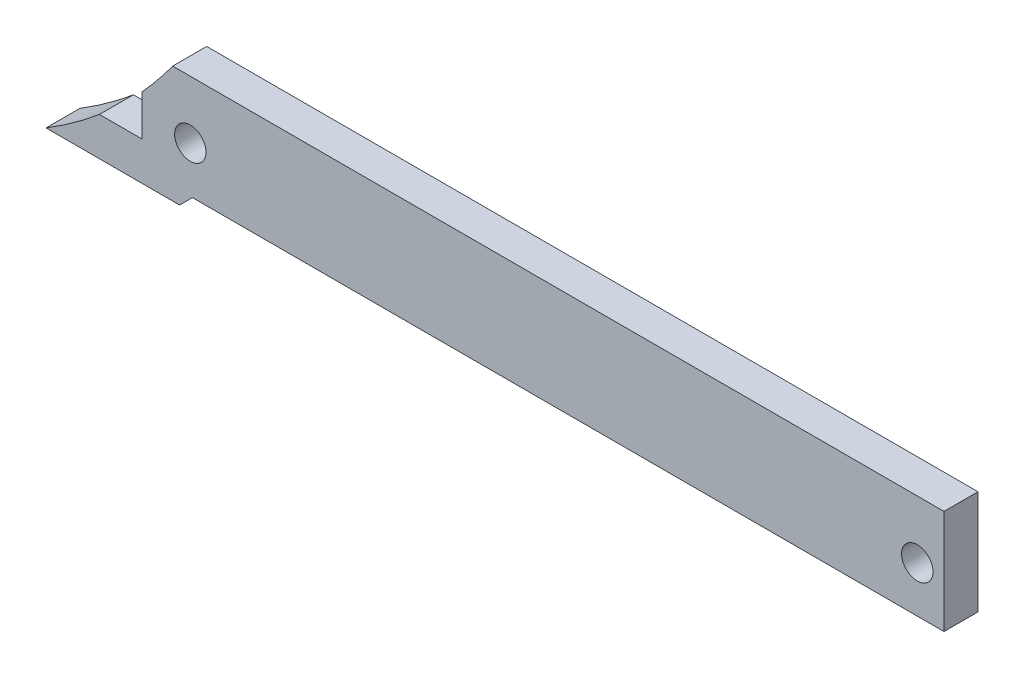
ISO-10303-21;
HEADER;
FILE_DESCRIPTION(('STEP AP214'),'2;1');
FILE_NAME('part.step','',(''),(''),'','','');
FILE_SCHEMA(('AUTOMOTIVE_DESIGN { 1 0 10303 214 1 1 1 1 }'));
ENDSEC;
DATA;
#1=APPLICATION_CONTEXT('core data for automotive mechanical design processes');
#2=APPLICATION_PROTOCOL_DEFINITION('international standard','automotive_design',2000,#1);
#3=PRODUCT_CONTEXT('',#1,'mechanical');
#4=PRODUCT('Part','Part','',(#3));
#5=PRODUCT_RELATED_PRODUCT_CATEGORY('part','',(#4));
#6=PRODUCT_DEFINITION_FORMATION('','',#4);
#7=PRODUCT_DEFINITION_CONTEXT('part definition',#1,'design');
#8=PRODUCT_DEFINITION('design','',#6,#7);
#9=PRODUCT_DEFINITION_SHAPE('','',#8);
#10=(LENGTH_UNIT() NAMED_UNIT(*) SI_UNIT(.MILLI.,.METRE.));
#11=(NAMED_UNIT(*) PLANE_ANGLE_UNIT() SI_UNIT($,.RADIAN.));
#12=(NAMED_UNIT(*) SI_UNIT($,.STERADIAN.) SOLID_ANGLE_UNIT());
#13=UNCERTAINTY_MEASURE_WITH_UNIT(LENGTH_MEASURE(1.E-05),#10,'distance_accuracy_value','');
#14=(GEOMETRIC_REPRESENTATION_CONTEXT(3) GLOBAL_UNCERTAINTY_ASSIGNED_CONTEXT((#13)) GLOBAL_UNIT_ASSIGNED_CONTEXT((#10,
#11,#12)) REPRESENTATION_CONTEXT('',''));
#15=CARTESIAN_POINT('',(0.,0.,0.));
#16=DIRECTION('',(0.,0.,1.));
#17=DIRECTION('',(1.,0.,0.));
#18=AXIS2_PLACEMENT_3D('',#15,#16,#17);
#19=CARTESIAN_POINT('',(-30.5121411623112,31.5191740095268,3.18));
#20=DIRECTION('',(0.,0.,-1.));
#21=DIRECTION('',(-1.,0.,0.));
#22=AXIS2_PLACEMENT_3D('',#19,#20,#21);
#23=PLANE('',#22);
#24=CARTESIAN_POINT('',(4.5,1.84,3.18));
#25=DIRECTION('',(0.,0.,1.));
#26=DIRECTION('',(1.,0.,0.));
#27=AXIS2_PLACEMENT_3D('',#24,#25,#26);
#28=CIRCLE('',#27,1.47);
#29=CARTESIAN_POINT('',(5.97,1.84,3.18));
#30=VERTEX_POINT('',#29);
#31=EDGE_CURVE('E196',#30,#30,#28,.T.);
#32=ORIENTED_EDGE('',*,*,#31,.F.);
#33=EDGE_LOOP('',(#32));
#34=FACE_BOUND('',#33,.T.);
#35=DIRECTION('',(0.,1.,0.));
#36=VECTOR('',#35,1.);
#37=CARTESIAN_POINT('',(75.,0.0244168797868836,3.18));
#38=LINE('',#37,#36);
#39=CARTESIAN_POINT('',(75.,-2.47558312021312,3.18));
#40=VERTEX_POINT('',#39);
#41=CARTESIAN_POINT('',(75.,7.25999999999985,3.18));
#42=VERTEX_POINT('',#41);
#43=EDGE_CURVE('E120',#40,#42,#38,.T.);
#44=ORIENTED_EDGE('',*,*,#43,.T.);
#45=DIRECTION('',(-1.,0.,0.));
#46=VECTOR('',#45,1.);
#47=CARTESIAN_POINT('',(2.85033740831529,7.25999999999985,3.18));
#48=LINE('',#47,#46);
#49=CARTESIAN_POINT('',(2.85033740831529,7.25999999999985,3.18));
#50=VERTEX_POINT('',#49);
#51=EDGE_CURVE('E164',#42,#50,#48,.T.);
#52=ORIENTED_EDGE('',*,*,#51,.T.);
#53=CARTESIAN_POINT('',(-30.5121411623086,31.5191740095271,3.18));
#54=DIRECTION('',(0.,0.,-1.));
#55=DIRECTION('',(-1.,0.,0.));
#56=AXIS2_PLACEMENT_3D('',#53,#54,#55);
#57=CIRCLE('',#56,41.2499999999983);
#58=CARTESIAN_POINT('',(0.,3.76000000000001,3.18));
#59=VERTEX_POINT('',#58);
#60=EDGE_CURVE('E182',#50,#59,#57,.T.);
#61=ORIENTED_EDGE('',*,*,#60,.T.);
#62=DIRECTION('',(0.,-1.,0.));
#63=VECTOR('',#62,1.);
#64=CARTESIAN_POINT('',(0.,0.,3.18));
#65=LINE('',#64,#63);
#66=CARTESIAN_POINT('',(0.,-0.0825485857634672,3.18));
#67=VERTEX_POINT('',#66);
#68=EDGE_CURVE('E90',#59,#67,#65,.T.);
#69=ORIENTED_EDGE('',*,*,#68,.T.);
#70=DIRECTION('',(-1.,0.,0.));
#71=VECTOR('',#70,1.);
#72=CARTESIAN_POINT('',(0.,-0.0825485857634672,3.18));
#73=LINE('',#72,#71);
#74=CARTESIAN_POINT('',(-4.,-0.0825485857634395,3.18));
#75=VERTEX_POINT('',#74);
#76=EDGE_CURVE('E208',#67,#75,#73,.T.);
#77=ORIENTED_EDGE('',*,*,#76,.T.);
#78=CARTESIAN_POINT('',(-30.5121411623112,31.5191740095268,3.18));
#79=DIRECTION('',(0.,0.,-1.));
#80=DIRECTION('',(-1.,0.,0.));
#81=AXIS2_PLACEMENT_3D('',#78,#79,#80);
#82=CIRCLE('',#81,41.25);
#83=CARTESIAN_POINT('',(-9.00000000000001,-3.67727868975512,3.18));
#84=VERTEX_POINT('',#83);
#85=EDGE_CURVE('E106',#75,#84,#82,.T.);
#86=ORIENTED_EDGE('',*,*,#85,.T.);
#87=DIRECTION('',(1.,0.,0.));
#88=VECTOR('',#87,1.);
#89=CARTESIAN_POINT('',(-9.00000000000001,-3.67727868975512,3.18));
#90=LINE('',#89,#88);
#91=CARTESIAN_POINT('',(3.5,-3.67727868975512,3.18));
#92=VERTEX_POINT('',#91);
#93=EDGE_CURVE('E100',#84,#92,#90,.T.);
#94=ORIENTED_EDGE('',*,*,#93,.T.);
#95=DIRECTION('',(0.707106781186546,0.707106781186549,0.));
#96=VECTOR('',#95,1.);
#97=CARTESIAN_POINT('',(3.5,-3.67727868975512,3.18));
#98=LINE('',#97,#96);
#99=CARTESIAN_POINT('',(4.70169556954198,-2.47558312021314,3.18));
#100=VERTEX_POINT('',#99);
#101=EDGE_CURVE('E104',#92,#100,#98,.T.);
#102=ORIENTED_EDGE('',*,*,#101,.T.);
#103=DIRECTION('',(1.,0.,0.));
#104=VECTOR('',#103,1.);
#105=CARTESIAN_POINT('',(75.,-2.47558312021312,3.18));
#106=LINE('',#105,#104);
#107=EDGE_CURVE('E50',#100,#40,#106,.T.);
#108=ORIENTED_EDGE('',*,*,#107,.T.);
#109=EDGE_LOOP('',(#44,#52,#61,#69,#77,#86,#94,#102,#108));
#110=FACE_BOUND('',#109,.T.);
#111=CARTESIAN_POINT('',(72.5,1.84,3.18));
#112=DIRECTION('',(0.,0.,1.));
#113=DIRECTION('',(1.,0.,0.));
#114=AXIS2_PLACEMENT_3D('',#111,#112,#113);
#115=CIRCLE('',#114,1.46999999999999);
#116=CARTESIAN_POINT('',(71.03,1.84,3.18));
#117=VERTEX_POINT('',#116);
#118=EDGE_CURVE('E129',#117,#117,#115,.T.);
#119=ORIENTED_EDGE('',*,*,#118,.F.);
#120=EDGE_LOOP('',(#119));
#121=FACE_BOUND('',#120,.T.);
#122=ADVANCED_FACE('F33',(#34,#110,#121),#23,.F.);
#123=CARTESIAN_POINT('',(-30.5121411623112,31.5191740095268,0.));
#124=DIRECTION('',(0.,0.,-1.));
#125=DIRECTION('',(-1.,0.,0.));
#126=AXIS2_PLACEMENT_3D('',#123,#124,#125);
#127=PLANE('',#126);
#128=DIRECTION('',(0.,-1.,0.));
#129=VECTOR('',#128,1.);
#130=CARTESIAN_POINT('',(0.,0.,0.));
#131=LINE('',#130,#129);
#132=CARTESIAN_POINT('',(0.,3.75999999999985,0.));
#133=VERTEX_POINT('',#132);
#134=CARTESIAN_POINT('',(0.,-0.0825485857634672,0.));
#135=VERTEX_POINT('',#134);
#136=EDGE_CURVE('E136',#133,#135,#131,.T.);
#137=ORIENTED_EDGE('',*,*,#136,.F.);
#138=CARTESIAN_POINT('',(-30.5121411623086,31.5191740095271,0.));
#139=DIRECTION('',(0.,0.,1.));
#140=DIRECTION('',(1.,0.,0.));
#141=AXIS2_PLACEMENT_3D('',#138,#139,#140);
#142=CIRCLE('',#141,41.2499999999983);
#143=CARTESIAN_POINT('',(2.85033740831529,7.25999999999985,0.));
#144=VERTEX_POINT('',#143);
#145=EDGE_CURVE('E181',#133,#144,#142,.T.);
#146=ORIENTED_EDGE('',*,*,#145,.T.);
#147=DIRECTION('',(1.,0.,0.));
#148=VECTOR('',#147,1.);
#149=CARTESIAN_POINT('',(2.85033740831529,7.25999999999985,0.));
#150=LINE('',#149,#148);
#151=CARTESIAN_POINT('',(75.,7.25999999999985,0.));
#152=VERTEX_POINT('',#151);
#153=EDGE_CURVE('E184',#144,#152,#150,.T.);
#154=ORIENTED_EDGE('',*,*,#153,.T.);
#155=DIRECTION('',(0.,1.,0.));
#156=VECTOR('',#155,1.);
#157=CARTESIAN_POINT('',(75.,0.0244168797868836,0.));
#158=LINE('',#157,#156);
#159=CARTESIAN_POINT('',(75.,-2.47558312021312,0.));
#160=VERTEX_POINT('',#159);
#161=EDGE_CURVE('E82',#160,#152,#158,.T.);
#162=ORIENTED_EDGE('',*,*,#161,.F.);
#163=DIRECTION('',(1.,0.,0.));
#164=VECTOR('',#163,1.);
#165=CARTESIAN_POINT('',(75.,-2.47558312021312,0.));
#166=LINE('',#165,#164);
#167=CARTESIAN_POINT('',(4.70169556954198,-2.47558312021314,0.));
#168=VERTEX_POINT('',#167);
#169=EDGE_CURVE('E133',#168,#160,#166,.T.);
#170=ORIENTED_EDGE('',*,*,#169,.F.);
#171=DIRECTION('',(0.707106781186546,0.707106781186549,0.));
#172=VECTOR('',#171,1.);
#173=CARTESIAN_POINT('',(3.5,-3.67727868975512,0.));
#174=LINE('',#173,#172);
#175=CARTESIAN_POINT('',(3.5,-3.67727868975512,0.));
#176=VERTEX_POINT('',#175);
#177=EDGE_CURVE('E74',#176,#168,#174,.T.);
#178=ORIENTED_EDGE('',*,*,#177,.F.);
#179=DIRECTION('',(1.,0.,0.));
#180=VECTOR('',#179,1.);
#181=CARTESIAN_POINT('',(-9.00000000000001,-3.67727868975512,0.));
#182=LINE('',#181,#180);
#183=CARTESIAN_POINT('',(-9.00000000000001,-3.67727868975512,0.));
#184=VERTEX_POINT('',#183);
#185=EDGE_CURVE('E114',#184,#176,#182,.T.);
#186=ORIENTED_EDGE('',*,*,#185,.F.);
#187=CARTESIAN_POINT('',(-30.5121411623112,31.5191740095268,0.));
#188=DIRECTION('',(0.,0.,-1.));
#189=DIRECTION('',(-1.,0.,0.));
#190=AXIS2_PLACEMENT_3D('',#187,#188,#189);
#191=CIRCLE('',#190,41.25);
#192=CARTESIAN_POINT('',(-4.,-0.0825485857634395,0.));
#193=VERTEX_POINT('',#192);
#194=EDGE_CURVE('E128',#193,#184,#191,.T.);
#195=ORIENTED_EDGE('',*,*,#194,.F.);
#196=DIRECTION('',(-1.,0.,0.));
#197=VECTOR('',#196,1.);
#198=CARTESIAN_POINT('',(0.,-0.0825485857634672,0.));
#199=LINE('',#198,#197);
#200=EDGE_CURVE('E126',#135,#193,#199,.T.);
#201=ORIENTED_EDGE('',*,*,#200,.F.);
#202=EDGE_LOOP('',(#137,#146,#154,#162,#170,#178,#186,#195,#201));
#203=FACE_BOUND('',#202,.T.);
#204=CARTESIAN_POINT('',(4.5,1.84,0.));
#205=DIRECTION('',(0.,0.,1.));
#206=DIRECTION('',(1.,0.,0.));
#207=AXIS2_PLACEMENT_3D('',#204,#205,#206);
#208=CIRCLE('',#207,1.47);
#209=CARTESIAN_POINT('',(5.97,1.84,0.));
#210=VERTEX_POINT('',#209);
#211=EDGE_CURVE('E197',#210,#210,#208,.T.);
#212=ORIENTED_EDGE('',*,*,#211,.T.);
#213=EDGE_LOOP('',(#212));
#214=FACE_BOUND('',#213,.T.);
#215=CARTESIAN_POINT('',(72.5,1.84,0.));
#216=DIRECTION('',(0.,0.,1.));
#217=DIRECTION('',(1.,0.,0.));
#218=AXIS2_PLACEMENT_3D('',#215,#216,#217);
#219=CIRCLE('',#218,1.46999999999999);
#220=CARTESIAN_POINT('',(71.03,1.84,0.));
#221=VERTEX_POINT('',#220);
#222=EDGE_CURVE('E200',#221,#221,#219,.T.);
#223=ORIENTED_EDGE('',*,*,#222,.T.);
#224=EDGE_LOOP('',(#223));
#225=FACE_BOUND('',#224,.T.);
#226=ADVANCED_FACE('F149',(#203,#214,#225),#127,.T.);
#227=CARTESIAN_POINT('',(0.,-0.0825485857634672,3.18));
#228=DIRECTION('',(0.,-1.,0.));
#229=DIRECTION('',(1.,0.,0.));
#230=AXIS2_PLACEMENT_3D('',#227,#228,#229);
#231=PLANE('',#230);
#232=ORIENTED_EDGE('',*,*,#200,.T.);
#233=DIRECTION('',(0.,0.,-1.));
#234=VECTOR('',#233,1.);
#235=CARTESIAN_POINT('',(-4.,-0.0825485857634395,3.18));
#236=LINE('',#235,#234);
#237=EDGE_CURVE('E42',#75,#193,#236,.T.);
#238=ORIENTED_EDGE('',*,*,#237,.F.);
#239=ORIENTED_EDGE('',*,*,#76,.F.);
#240=DIRECTION('',(0.,0.,-1.));
#241=VECTOR('',#240,1.);
#242=CARTESIAN_POINT('',(0.,-0.0825485857634672,3.18));
#243=LINE('',#242,#241);
#244=EDGE_CURVE('E11',#67,#135,#243,.T.);
#245=ORIENTED_EDGE('',*,*,#244,.T.);
#246=EDGE_LOOP('',(#232,#238,#239,#245));
#247=FACE_BOUND('',#246,.T.);
#248=ADVANCED_FACE('F35',(#247),#231,.F.);
#249=CARTESIAN_POINT('',(-30.5121411623112,31.5191740095268,3.18));
#250=DIRECTION('',(0.,0.,-1.));
#251=DIRECTION('',(-1.,0.,0.));
#252=AXIS2_PLACEMENT_3D('',#249,#250,#251);
#253=CYLINDRICAL_SURFACE('',#252,41.25);
#254=ORIENTED_EDGE('',*,*,#194,.T.);
#255=DIRECTION('',(0.,0.,-1.));
#256=VECTOR('',#255,1.);
#257=CARTESIAN_POINT('',(-9.00000000000001,-3.67727868975512,3.18));
#258=LINE('',#257,#256);
#259=EDGE_CURVE('E115',#84,#184,#258,.T.);
#260=ORIENTED_EDGE('',*,*,#259,.F.);
#261=ORIENTED_EDGE('',*,*,#85,.F.);
#262=ORIENTED_EDGE('',*,*,#237,.T.);
#263=EDGE_LOOP('',(#254,#260,#261,#262));
#264=FACE_BOUND('',#263,.T.);
#265=ADVANCED_FACE('F145',(#264),#253,.F.);
#266=CARTESIAN_POINT('',(-9.00000000000001,-3.67727868975512,3.18));
#267=DIRECTION('',(0.,1.,0.));
#268=DIRECTION('',(-1.,0.,0.));
#269=AXIS2_PLACEMENT_3D('',#266,#267,#268);
#270=PLANE('',#269);
#271=ORIENTED_EDGE('',*,*,#185,.T.);
#272=DIRECTION('',(0.,0.,-1.));
#273=VECTOR('',#272,1.);
#274=CARTESIAN_POINT('',(3.5,-3.67727868975512,3.18));
#275=LINE('',#274,#273);
#276=EDGE_CURVE('E111',#92,#176,#275,.T.);
#277=ORIENTED_EDGE('',*,*,#276,.F.);
#278=ORIENTED_EDGE('',*,*,#93,.F.);
#279=ORIENTED_EDGE('',*,*,#259,.T.);
#280=EDGE_LOOP('',(#271,#277,#278,#279));
#281=FACE_BOUND('',#280,.T.);
#282=ADVANCED_FACE('F112',(#281),#270,.F.);
#283=CARTESIAN_POINT('',(3.5,-3.67727868975512,3.18));
#284=DIRECTION('',(-0.707106781186549,0.707106781186546,0.));
#285=DIRECTION('',(-0.707106781186546,-0.707106781186549,0.));
#286=AXIS2_PLACEMENT_3D('',#283,#284,#285);
#287=PLANE('',#286);
#288=ORIENTED_EDGE('',*,*,#177,.T.);
#289=DIRECTION('',(0.,0.,-1.));
#290=VECTOR('',#289,1.);
#291=CARTESIAN_POINT('',(4.70169556954198,-2.47558312021314,3.18));
#292=LINE('',#291,#290);
#293=EDGE_CURVE('E116',#100,#168,#292,.T.);
#294=ORIENTED_EDGE('',*,*,#293,.F.);
#295=ORIENTED_EDGE('',*,*,#101,.F.);
#296=ORIENTED_EDGE('',*,*,#276,.T.);
#297=EDGE_LOOP('',(#288,#294,#295,#296));
#298=FACE_BOUND('',#297,.T.);
#299=ADVANCED_FACE('F118',(#298),#287,.F.);
#300=CARTESIAN_POINT('',(75.,-2.47558312021312,3.18));
#301=DIRECTION('',(0.,1.,0.));
#302=DIRECTION('',(-1.,0.,0.));
#303=AXIS2_PLACEMENT_3D('',#300,#301,#302);
#304=PLANE('',#303);
#305=ORIENTED_EDGE('',*,*,#169,.T.);
#306=DIRECTION('',(0.,0.,-1.));
#307=VECTOR('',#306,1.);
#308=CARTESIAN_POINT('',(75.,-2.47558312021312,3.18));
#309=LINE('',#308,#307);
#310=EDGE_CURVE('E125',#40,#160,#309,.T.);
#311=ORIENTED_EDGE('',*,*,#310,.F.);
#312=ORIENTED_EDGE('',*,*,#107,.F.);
#313=ORIENTED_EDGE('',*,*,#293,.T.);
#314=EDGE_LOOP('',(#305,#311,#312,#313));
#315=FACE_BOUND('',#314,.T.);
#316=ADVANCED_FACE('F152',(#315),#304,.F.);
#317=CARTESIAN_POINT('',(75.,0.0244168797868836,3.18));
#318=DIRECTION('',(-1.,0.,0.));
#319=DIRECTION('',(0.,0.,1.));
#320=AXIS2_PLACEMENT_3D('',#317,#318,#319);
#321=PLANE('',#320);
#322=ORIENTED_EDGE('',*,*,#161,.T.);
#323=DIRECTION('',(0.,0.,-1.));
#324=VECTOR('',#323,1.);
#325=CARTESIAN_POINT('',(75.,7.25999999999985,78.2616222520531));
#326=LINE('',#325,#324);
#327=EDGE_CURVE('E160',#42,#152,#326,.T.);
#328=ORIENTED_EDGE('',*,*,#327,.F.);
#329=ORIENTED_EDGE('',*,*,#43,.F.);
#330=ORIENTED_EDGE('',*,*,#310,.T.);
#331=EDGE_LOOP('',(#322,#328,#329,#330));
#332=FACE_BOUND('',#331,.T.);
#333=ADVANCED_FACE('F155',(#332),#321,.F.);
#334=CARTESIAN_POINT('',(0.,0.,3.18));
#335=DIRECTION('',(1.,0.,0.));
#336=DIRECTION('',(0.,0.,-1.));
#337=AXIS2_PLACEMENT_3D('',#334,#335,#336);
#338=PLANE('',#337);
#339=ORIENTED_EDGE('',*,*,#68,.F.);
#340=DIRECTION('',(0.,0.,1.));
#341=VECTOR('',#340,1.);
#342=CARTESIAN_POINT('',(0.,3.76000000000001,0.));
#343=LINE('',#342,#341);
#344=EDGE_CURVE('E194',#133,#59,#343,.T.);
#345=ORIENTED_EDGE('',*,*,#344,.F.);
#346=ORIENTED_EDGE('',*,*,#136,.T.);
#347=ORIENTED_EDGE('',*,*,#244,.F.);
#348=EDGE_LOOP('',(#339,#345,#346,#347));
#349=FACE_BOUND('',#348,.T.);
#350=ADVANCED_FACE('F211',(#349),#338,.F.);
#351=CARTESIAN_POINT('',(72.5,1.84,3.18));
#352=DIRECTION('',(0.,0.,-1.));
#353=DIRECTION('',(-1.,0.,0.));
#354=AXIS2_PLACEMENT_3D('',#351,#352,#353);
#355=CYLINDRICAL_SURFACE('',#354,1.46999999999999);
#356=CARTESIAN_POINT('',(71.03,1.84,3.18));
#357=CARTESIAN_POINT('',(71.03,1.84,3.146875));
#358=CARTESIAN_POINT('',(71.03,1.84,3.11375));
#359=CARTESIAN_POINT('',(71.03,1.84,3.0475));
#360=CARTESIAN_POINT('',(71.03,1.84,3.014375));
#361=CARTESIAN_POINT('',(71.03,1.84,2.948125));
#362=CARTESIAN_POINT('',(71.03,1.84,2.915));
#363=CARTESIAN_POINT('',(71.03,1.84,2.84875));
#364=CARTESIAN_POINT('',(71.03,1.84,2.815625));
#365=CARTESIAN_POINT('',(71.03,1.84,2.749375));
#366=CARTESIAN_POINT('',(71.03,1.84,2.71625));
#367=CARTESIAN_POINT('',(71.03,1.84,2.65));
#368=CARTESIAN_POINT('',(71.03,1.84,2.616875));
#369=CARTESIAN_POINT('',(71.03,1.84,2.550625));
#370=CARTESIAN_POINT('',(71.03,1.84,2.5175));
#371=CARTESIAN_POINT('',(71.03,1.84,2.45125));
#372=CARTESIAN_POINT('',(71.03,1.84,2.418125));
#373=CARTESIAN_POINT('',(71.03,1.84,2.351875));
#374=CARTESIAN_POINT('',(71.03,1.84,2.31875));
#375=CARTESIAN_POINT('',(71.03,1.84,2.2525));
#376=CARTESIAN_POINT('',(71.03,1.84,2.219375));
#377=CARTESIAN_POINT('',(71.03,1.84,2.153125));
#378=CARTESIAN_POINT('',(71.03,1.84,2.12));
#379=CARTESIAN_POINT('',(71.03,1.84,2.05375));
#380=CARTESIAN_POINT('',(71.03,1.84,2.020625));
#381=CARTESIAN_POINT('',(71.03,1.84,1.954375));
#382=CARTESIAN_POINT('',(71.03,1.84,1.92125));
#383=CARTESIAN_POINT('',(71.03,1.84,1.855));
#384=CARTESIAN_POINT('',(71.03,1.84,1.821875));
#385=CARTESIAN_POINT('',(71.03,1.84,1.755625));
#386=CARTESIAN_POINT('',(71.03,1.84,1.7225));
#387=CARTESIAN_POINT('',(71.03,1.84,1.65625));
#388=CARTESIAN_POINT('',(71.03,1.84,1.623125));
#389=CARTESIAN_POINT('',(71.03,1.84,1.556875));
#390=CARTESIAN_POINT('',(71.03,1.84,1.52375));
#391=CARTESIAN_POINT('',(71.03,1.84,1.4575));
#392=CARTESIAN_POINT('',(71.03,1.84,1.424375));
#393=CARTESIAN_POINT('',(71.03,1.84,1.358125));
#394=CARTESIAN_POINT('',(71.03,1.84,1.325));
#395=CARTESIAN_POINT('',(71.03,1.84,1.25875));
#396=CARTESIAN_POINT('',(71.03,1.84,1.225625));
#397=CARTESIAN_POINT('',(71.03,1.84,1.159375));
#398=CARTESIAN_POINT('',(71.03,1.84,1.12625));
#399=CARTESIAN_POINT('',(71.03,1.84,1.06));
#400=CARTESIAN_POINT('',(71.03,1.84,1.026875));
#401=CARTESIAN_POINT('',(71.03,1.84,0.960625));
#402=CARTESIAN_POINT('',(71.03,1.84,0.9275));
#403=CARTESIAN_POINT('',(71.03,1.84,0.86125));
#404=CARTESIAN_POINT('',(71.03,1.84,0.828125));
#405=CARTESIAN_POINT('',(71.03,1.84,0.761875));
#406=CARTESIAN_POINT('',(71.03,1.84,0.72875));
#407=CARTESIAN_POINT('',(71.03,1.84,0.6625));
#408=CARTESIAN_POINT('',(71.03,1.84,0.629375));
#409=CARTESIAN_POINT('',(71.03,1.84,0.563125));
#410=CARTESIAN_POINT('',(71.03,1.84,0.53));
#411=CARTESIAN_POINT('',(71.03,1.84,0.46375));
#412=CARTESIAN_POINT('',(71.03,1.84,0.430625));
#413=CARTESIAN_POINT('',(71.03,1.84,0.364375));
#414=CARTESIAN_POINT('',(71.03,1.84,0.33125));
#415=CARTESIAN_POINT('',(71.03,1.84,0.265));
#416=CARTESIAN_POINT('',(71.03,1.84,0.231875));
#417=CARTESIAN_POINT('',(71.03,1.84,0.165625));
#418=CARTESIAN_POINT('',(71.03,1.84,0.1325));
#419=CARTESIAN_POINT('',(71.03,1.84,0.06625));
#420=CARTESIAN_POINT('',(71.03,1.84,0.033125));
#421=CARTESIAN_POINT('',(71.03,1.84,0.));
#422=B_SPLINE_CURVE_WITH_KNOTS('',3,(#356,#357,#358,#359,#360,#361,#362,#363,#364,#365,#366,
#367,#368,#369,#370,#371,#372,#373,#374,#375,#376,#377,#378,#379,#380,#381,#382,#383,#384,#385,
#386,#387,#388,#389,#390,#391,#392,#393,#394,#395,#396,#397,#398,#399,#400,#401,#402,#403,#404,
#405,#406,#407,#408,#409,#410,#411,#412,#413,#414,#415,#416,#417,#418,#419,#420,#421),
.UNSPECIFIED.,.F.,.F.,(4,2,2,2,2,2,2,2,2,2,2,2,2,2,2,2,2,2,2,2,2,2,2,2,2,2,2,2,2,2,2,2,4),(0.,
0.0993750000000001,0.19875,0.298125,0.3975,0.496875,0.59625,0.695625,0.795,0.894375,0.99375,
1.093125,1.1925,1.291875,1.39125,1.490625,1.59,1.689375,1.78875,1.888125,1.9875,2.086875,
2.18625,2.285625,2.385,2.484375,2.58375,2.683125,2.7825,2.881875,2.98125,3.080625,3.18),.UNSPECIFIED.);
#423=EDGE_CURVE('BSEAM213',#117,#221,#422,.T.);
#424=ORIENTED_EDGE('',*,*,#118,.T.);
#425=ORIENTED_EDGE('',*,*,#222,.F.);
#426=ORIENTED_EDGE('',*,*,#423,.T.);
#427=ORIENTED_EDGE('',*,*,#423,.F.);
#428=EDGE_LOOP('',(#424,#426,#425,#427));
#429=FACE_BOUND('',#428,.T.);
#430=ADVANCED_FACE('F213',(#429),#355,.F.);
#431=CARTESIAN_POINT('',(4.5,1.84,0.));
#432=DIRECTION('',(0.,0.,1.));
#433=DIRECTION('',(1.,0.,0.));
#434=AXIS2_PLACEMENT_3D('',#431,#432,#433);
#435=CYLINDRICAL_SURFACE('',#434,1.47);
#436=CARTESIAN_POINT('',(5.97,1.84,0.));
#437=CARTESIAN_POINT('',(5.97,1.84,0.033125));
#438=CARTESIAN_POINT('',(5.97,1.84,0.06625));
#439=CARTESIAN_POINT('',(5.97,1.84,0.1325));
#440=CARTESIAN_POINT('',(5.97,1.84,0.165625));
#441=CARTESIAN_POINT('',(5.97,1.84,0.231875));
#442=CARTESIAN_POINT('',(5.97,1.84,0.265));
#443=CARTESIAN_POINT('',(5.97,1.84,0.33125));
#444=CARTESIAN_POINT('',(5.97,1.84,0.364375));
#445=CARTESIAN_POINT('',(5.97,1.84,0.430625));
#446=CARTESIAN_POINT('',(5.97,1.84,0.46375));
#447=CARTESIAN_POINT('',(5.97,1.84,0.53));
#448=CARTESIAN_POINT('',(5.97,1.84,0.563125));
#449=CARTESIAN_POINT('',(5.97,1.84,0.629375));
#450=CARTESIAN_POINT('',(5.97,1.84,0.6625));
#451=CARTESIAN_POINT('',(5.97,1.84,0.72875));
#452=CARTESIAN_POINT('',(5.97,1.84,0.761875));
#453=CARTESIAN_POINT('',(5.97,1.84,0.828125));
#454=CARTESIAN_POINT('',(5.97,1.84,0.86125));
#455=CARTESIAN_POINT('',(5.97,1.84,0.9275));
#456=CARTESIAN_POINT('',(5.97,1.84,0.960625));
#457=CARTESIAN_POINT('',(5.97,1.84,1.026875));
#458=CARTESIAN_POINT('',(5.97,1.84,1.06));
#459=CARTESIAN_POINT('',(5.97,1.84,1.12625));
#460=CARTESIAN_POINT('',(5.97,1.84,1.159375));
#461=CARTESIAN_POINT('',(5.97,1.84,1.225625));
#462=CARTESIAN_POINT('',(5.97,1.84,1.25875));
#463=CARTESIAN_POINT('',(5.97,1.84,1.325));
#464=CARTESIAN_POINT('',(5.97,1.84,1.358125));
#465=CARTESIAN_POINT('',(5.97,1.84,1.424375));
#466=CARTESIAN_POINT('',(5.97,1.84,1.4575));
#467=CARTESIAN_POINT('',(5.97,1.84,1.52375));
#468=CARTESIAN_POINT('',(5.97,1.84,1.556875));
#469=CARTESIAN_POINT('',(5.97,1.84,1.623125));
#470=CARTESIAN_POINT('',(5.97,1.84,1.65625));
#471=CARTESIAN_POINT('',(5.97,1.84,1.7225));
#472=CARTESIAN_POINT('',(5.97,1.84,1.755625));
#473=CARTESIAN_POINT('',(5.97,1.84,1.821875));
#474=CARTESIAN_POINT('',(5.97,1.84,1.855));
#475=CARTESIAN_POINT('',(5.97,1.84,1.92125));
#476=CARTESIAN_POINT('',(5.97,1.84,1.954375));
#477=CARTESIAN_POINT('',(5.97,1.84,2.020625));
#478=CARTESIAN_POINT('',(5.97,1.84,2.05375));
#479=CARTESIAN_POINT('',(5.97,1.84,2.12));
#480=CARTESIAN_POINT('',(5.97,1.84,2.153125));
#481=CARTESIAN_POINT('',(5.97,1.84,2.219375));
#482=CARTESIAN_POINT('',(5.97,1.84,2.2525));
#483=CARTESIAN_POINT('',(5.97,1.84,2.31875));
#484=CARTESIAN_POINT('',(5.97,1.84,2.351875));
#485=CARTESIAN_POINT('',(5.97,1.84,2.418125));
#486=CARTESIAN_POINT('',(5.97,1.84,2.45125));
#487=CARTESIAN_POINT('',(5.97,1.84,2.5175));
#488=CARTESIAN_POINT('',(5.97,1.84,2.550625));
#489=CARTESIAN_POINT('',(5.97,1.84,2.616875));
#490=CARTESIAN_POINT('',(5.97,1.84,2.65));
#491=CARTESIAN_POINT('',(5.97,1.84,2.71625));
#492=CARTESIAN_POINT('',(5.97,1.84,2.749375));
#493=CARTESIAN_POINT('',(5.97,1.84,2.815625));
#494=CARTESIAN_POINT('',(5.97,1.84,2.84875));
#495=CARTESIAN_POINT('',(5.97,1.84,2.915));
#496=CARTESIAN_POINT('',(5.97,1.84,2.948125));
#497=CARTESIAN_POINT('',(5.97,1.84,3.014375));
#498=CARTESIAN_POINT('',(5.97,1.84,3.0475));
#499=CARTESIAN_POINT('',(5.97,1.84,3.11375));
#500=CARTESIAN_POINT('',(5.97,1.84,3.146875));
#501=CARTESIAN_POINT('',(5.97,1.84,3.18));
#502=B_SPLINE_CURVE_WITH_KNOTS('',3,(#436,#437,#438,#439,#440,#441,#442,#443,#444,#445,#446,
#447,#448,#449,#450,#451,#452,#453,#454,#455,#456,#457,#458,#459,#460,#461,#462,#463,#464,#465,
#466,#467,#468,#469,#470,#471,#472,#473,#474,#475,#476,#477,#478,#479,#480,#481,#482,#483,#484,
#485,#486,#487,#488,#489,#490,#491,#492,#493,#494,#495,#496,#497,#498,#499,#500,#501),
.UNSPECIFIED.,.F.,.F.,(4,2,2,2,2,2,2,2,2,2,2,2,2,2,2,2,2,2,2,2,2,2,2,2,2,2,2,2,2,2,2,2,4),(0.,
0.099375,0.19875,0.298125,0.3975,0.496875,0.59625,0.695625,0.795,0.894375,0.99375,1.093125,
1.1925,1.291875,1.39125,1.490625,1.59,1.689375,1.78875,1.888125,1.9875,2.086875,2.18625,
2.285625,2.385,2.484375,2.58375,2.683125,2.7825,2.881875,2.98125,3.080625,3.18),.UNSPECIFIED.);
#503=EDGE_CURVE('BSEAM220',#210,#30,#502,.T.);
#504=ORIENTED_EDGE('',*,*,#211,.F.);
#505=ORIENTED_EDGE('',*,*,#31,.T.);
#506=ORIENTED_EDGE('',*,*,#503,.T.);
#507=ORIENTED_EDGE('',*,*,#503,.F.);
#508=EDGE_LOOP('',(#504,#506,#505,#507));
#509=FACE_BOUND('',#508,.T.);
#510=ADVANCED_FACE('F220',(#509),#435,.F.);
#511=CARTESIAN_POINT('',(-30.5121411623086,31.5191740095271,78.2616222520531));
#512=DIRECTION('',(0.,0.,-1.));
#513=DIRECTION('',(-1.,0.,0.));
#514=AXIS2_PLACEMENT_3D('',#511,#512,#513);
#515=CYLINDRICAL_SURFACE('',#514,41.2499999999983);
#516=ORIENTED_EDGE('',*,*,#60,.F.);
#517=DIRECTION('',(0.,0.,-1.));
#518=VECTOR('',#517,1.);
#519=CARTESIAN_POINT('',(2.85033740831529,7.25999999999985,78.2616222520531));
#520=LINE('',#519,#518);
#521=EDGE_CURVE('E176',#50,#144,#520,.T.);
#522=ORIENTED_EDGE('',*,*,#521,.T.);
#523=ORIENTED_EDGE('',*,*,#145,.F.);
#524=ORIENTED_EDGE('',*,*,#344,.T.);
#525=EDGE_LOOP('',(#516,#522,#523,#524));
#526=FACE_BOUND('',#525,.T.);
#527=ADVANCED_FACE('F178',(#526),#515,.F.);
#528=CARTESIAN_POINT('',(2.85033740831529,7.25999999999985,78.2616222520531));
#529=DIRECTION('',(0.,1.,0.));
#530=DIRECTION('',(0.,0.,1.));
#531=AXIS2_PLACEMENT_3D('',#528,#529,#530);
#532=PLANE('',#531);
#533=ORIENTED_EDGE('',*,*,#51,.F.);
#534=ORIENTED_EDGE('',*,*,#327,.T.);
#535=ORIENTED_EDGE('',*,*,#153,.F.);
#536=ORIENTED_EDGE('',*,*,#521,.F.);
#537=EDGE_LOOP('',(#533,#534,#535,#536));
#538=FACE_BOUND('',#537,.T.);
#539=ADVANCED_FACE('F186',(#538),#532,.T.);
#540=CLOSED_SHELL('',(#122,#226,#248,#265,#282,#299,#316,#333,#350,#430,#510,#527,#539));
#541=MANIFOLD_SOLID_BREP('B2',#540);
#542=ADVANCED_BREP_SHAPE_REPRESENTATION('',(#18,#541),#14);
#543=SHAPE_DEFINITION_REPRESENTATION(#9,#542);
ENDSEC;
END-ISO-10303-21;
